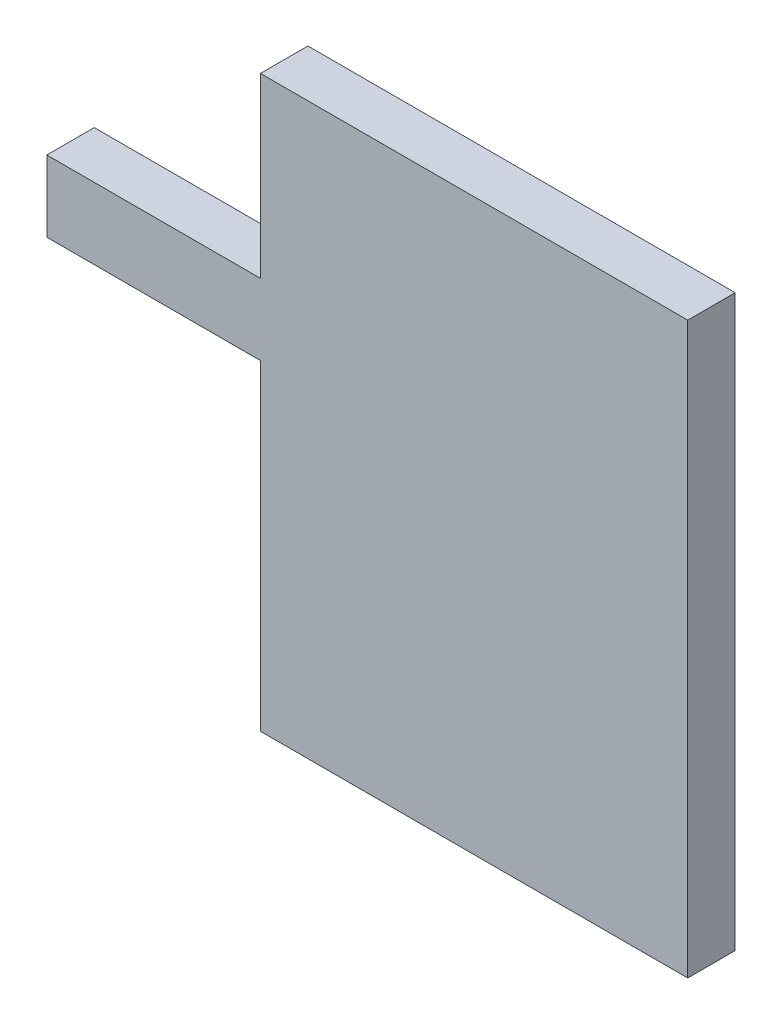
ISO-10303-21;
HEADER;
FILE_DESCRIPTION(('STEP AP214'),'2;1');
FILE_NAME('part.step','',(''),(''),'','','');
FILE_SCHEMA(('AUTOMOTIVE_DESIGN { 1 0 10303 214 1 1 1 1 }'));
ENDSEC;
DATA;
#1=APPLICATION_CONTEXT('core data for automotive mechanical design processes');
#2=APPLICATION_PROTOCOL_DEFINITION('international standard','automotive_design',2000,#1);
#3=PRODUCT_CONTEXT('',#1,'mechanical');
#4=PRODUCT('Part','Part','',(#3));
#5=PRODUCT_RELATED_PRODUCT_CATEGORY('part','',(#4));
#6=PRODUCT_DEFINITION_FORMATION('','',#4);
#7=PRODUCT_DEFINITION_CONTEXT('part definition',#1,'design');
#8=PRODUCT_DEFINITION('design','',#6,#7);
#9=PRODUCT_DEFINITION_SHAPE('','',#8);
#10=(LENGTH_UNIT() NAMED_UNIT(*) SI_UNIT(.MILLI.,.METRE.));
#11=(NAMED_UNIT(*) PLANE_ANGLE_UNIT() SI_UNIT($,.RADIAN.));
#12=(NAMED_UNIT(*) SI_UNIT($,.STERADIAN.) SOLID_ANGLE_UNIT());
#13=UNCERTAINTY_MEASURE_WITH_UNIT(LENGTH_MEASURE(1.E-05),#10,'distance_accuracy_value','');
#14=(GEOMETRIC_REPRESENTATION_CONTEXT(3) GLOBAL_UNCERTAINTY_ASSIGNED_CONTEXT((#13)) GLOBAL_UNIT_ASSIGNED_CONTEXT((#10,
#11,#12)) REPRESENTATION_CONTEXT('',''));
#15=CARTESIAN_POINT('',(0.,0.,0.));
#16=DIRECTION('',(0.,0.,1.));
#17=DIRECTION('',(1.,0.,0.));
#18=AXIS2_PLACEMENT_3D('',#15,#16,#17);
#19=CARTESIAN_POINT('',(-57.346581187662,74.8407030218855,10.));
#20=DIRECTION('',(1.,0.,0.));
#21=DIRECTION('',(0.,0.,-1.));
#22=AXIS2_PLACEMENT_3D('',#19,#20,#21);
#23=PLANE('',#22);
#24=DIRECTION('',(0.,-1.,0.));
#25=VECTOR('',#24,1.);
#26=CARTESIAN_POINT('',(-57.346581187662,74.8407030218855,0.));
#27=LINE('',#26,#25);
#28=CARTESIAN_POINT('',(-57.346581187662,74.8407030218855,0.));
#29=VERTEX_POINT('',#28);
#30=CARTESIAN_POINT('',(-57.346581187662,37.4607030218855,0.));
#31=VERTEX_POINT('',#30);
#32=EDGE_CURVE('E129',#29,#31,#27,.T.);
#33=ORIENTED_EDGE('',*,*,#32,.T.);
#34=DIRECTION('',(0.,0.,-1.));
#35=VECTOR('',#34,1.);
#36=CARTESIAN_POINT('',(-57.346581187662,37.4607030218855,10.));
#37=LINE('',#36,#35);
#38=CARTESIAN_POINT('',(-57.346581187662,37.4607030218855,10.));
#39=VERTEX_POINT('',#38);
#40=EDGE_CURVE('E11',#39,#31,#37,.T.);
#41=ORIENTED_EDGE('',*,*,#40,.F.);
#42=DIRECTION('',(0.,-1.,0.));
#43=VECTOR('',#42,1.);
#44=CARTESIAN_POINT('',(-57.346581187662,74.8407030218855,10.));
#45=LINE('',#44,#43);
#46=CARTESIAN_POINT('',(-57.346581187662,74.8407030218855,10.));
#47=VERTEX_POINT('',#46);
#48=EDGE_CURVE('E143',#47,#39,#45,.T.);
#49=ORIENTED_EDGE('',*,*,#48,.F.);
#50=DIRECTION('',(0.,0.,-1.));
#51=VECTOR('',#50,1.);
#52=CARTESIAN_POINT('',(-57.346581187662,74.8407030218855,10.));
#53=LINE('',#52,#51);
#54=EDGE_CURVE('E125',#47,#29,#53,.T.);
#55=ORIENTED_EDGE('',*,*,#54,.T.);
#56=EDGE_LOOP('',(#33,#41,#49,#55));
#57=FACE_BOUND('',#56,.T.);
#58=ADVANCED_FACE('F33',(#57),#23,.F.);
#59=CARTESIAN_POINT('',(-102.346581187662,37.4607030218855,10.));
#60=DIRECTION('',(0.,-1.,0.));
#61=DIRECTION('',(0.,0.,-1.));
#62=AXIS2_PLACEMENT_3D('',#59,#60,#61);
#63=PLANE('',#62);
#64=DIRECTION('',(-1.,0.,0.));
#65=VECTOR('',#64,1.);
#66=CARTESIAN_POINT('',(-102.346581187662,37.4607030218855,0.));
#67=LINE('',#66,#65);
#68=CARTESIAN_POINT('',(-102.346581187662,37.4607030218855,0.));
#69=VERTEX_POINT('',#68);
#70=EDGE_CURVE('E132',#31,#69,#67,.T.);
#71=ORIENTED_EDGE('',*,*,#70,.T.);
#72=DIRECTION('',(0.,0.,-1.));
#73=VECTOR('',#72,1.);
#74=CARTESIAN_POINT('',(-102.346581187662,37.4607030218855,10.));
#75=LINE('',#74,#73);
#76=CARTESIAN_POINT('',(-102.346581187662,37.4607030218855,10.));
#77=VERTEX_POINT('',#76);
#78=EDGE_CURVE('E41',#77,#69,#75,.T.);
#79=ORIENTED_EDGE('',*,*,#78,.F.);
#80=DIRECTION('',(-1.,0.,0.));
#81=VECTOR('',#80,1.);
#82=CARTESIAN_POINT('',(-102.346581187662,37.4607030218855,10.));
#83=LINE('',#82,#81);
#84=EDGE_CURVE('E92',#39,#77,#83,.T.);
#85=ORIENTED_EDGE('',*,*,#84,.F.);
#86=ORIENTED_EDGE('',*,*,#40,.T.);
#87=EDGE_LOOP('',(#71,#79,#85,#86));
#88=FACE_BOUND('',#87,.T.);
#89=ADVANCED_FACE('F178',(#88),#63,.F.);
#90=CARTESIAN_POINT('',(-102.346581187662,37.4607030218855,10.));
#91=DIRECTION('',(1.,0.,0.));
#92=DIRECTION('',(0.,0.,-1.));
#93=AXIS2_PLACEMENT_3D('',#90,#91,#92);
#94=PLANE('',#93);
#95=DIRECTION('',(0.,-1.,0.));
#96=VECTOR('',#95,1.);
#97=CARTESIAN_POINT('',(-102.346581187662,37.4607030218855,0.));
#98=LINE('',#97,#96);
#99=CARTESIAN_POINT('',(-102.346581187662,22.4607030218855,0.));
#100=VERTEX_POINT('',#99);
#101=EDGE_CURVE('E134',#69,#100,#98,.T.);
#102=ORIENTED_EDGE('',*,*,#101,.T.);
#103=DIRECTION('',(0.,0.,-1.));
#104=VECTOR('',#103,1.);
#105=CARTESIAN_POINT('',(-102.346581187662,22.4607030218855,10.));
#106=LINE('',#105,#104);
#107=CARTESIAN_POINT('',(-102.346581187662,22.4607030218855,10.));
#108=VERTEX_POINT('',#107);
#109=EDGE_CURVE('E150',#108,#100,#106,.T.);
#110=ORIENTED_EDGE('',*,*,#109,.F.);
#111=DIRECTION('',(0.,-1.,0.));
#112=VECTOR('',#111,1.);
#113=CARTESIAN_POINT('',(-102.346581187662,37.4607030218855,10.));
#114=LINE('',#113,#112);
#115=EDGE_CURVE('E158',#77,#108,#114,.T.);
#116=ORIENTED_EDGE('',*,*,#115,.F.);
#117=ORIENTED_EDGE('',*,*,#78,.T.);
#118=EDGE_LOOP('',(#102,#110,#116,#117));
#119=FACE_BOUND('',#118,.T.);
#120=ADVANCED_FACE('F156',(#119),#94,.F.);
#121=CARTESIAN_POINT('',(-102.346581187662,22.4607030218855,10.));
#122=DIRECTION('',(0.,1.,0.));
#123=DIRECTION('',(0.,0.,1.));
#124=AXIS2_PLACEMENT_3D('',#121,#122,#123);
#125=PLANE('',#124);
#126=DIRECTION('',(1.,0.,0.));
#127=VECTOR('',#126,1.);
#128=CARTESIAN_POINT('',(-102.346581187662,22.4607030218855,0.));
#129=LINE('',#128,#127);
#130=CARTESIAN_POINT('',(-57.346581187662,22.4607030218855,0.));
#131=VERTEX_POINT('',#130);
#132=EDGE_CURVE('E136',#100,#131,#129,.T.);
#133=ORIENTED_EDGE('',*,*,#132,.T.);
#134=DIRECTION('',(0.,0.,-1.));
#135=VECTOR('',#134,1.);
#136=CARTESIAN_POINT('',(-57.346581187662,22.4607030218855,10.));
#137=LINE('',#136,#135);
#138=CARTESIAN_POINT('',(-57.346581187662,22.4607030218855,10.));
#139=VERTEX_POINT('',#138);
#140=EDGE_CURVE('E147',#139,#131,#137,.T.);
#141=ORIENTED_EDGE('',*,*,#140,.F.);
#142=DIRECTION('',(1.,0.,0.));
#143=VECTOR('',#142,1.);
#144=CARTESIAN_POINT('',(-102.346581187662,22.4607030218855,10.));
#145=LINE('',#144,#143);
#146=EDGE_CURVE('E170',#108,#139,#145,.T.);
#147=ORIENTED_EDGE('',*,*,#146,.F.);
#148=ORIENTED_EDGE('',*,*,#109,.T.);
#149=EDGE_LOOP('',(#133,#141,#147,#148));
#150=FACE_BOUND('',#149,.T.);
#151=ADVANCED_FACE('F166',(#150),#125,.F.);
#152=CARTESIAN_POINT('',(-57.346581187662,22.4607030218855,10.));
#153=DIRECTION('',(1.,0.,0.));
#154=DIRECTION('',(0.,1.,0.));
#155=AXIS2_PLACEMENT_3D('',#152,#153,#154);
#156=PLANE('',#155);
#157=DIRECTION('',(0.,-1.,0.));
#158=VECTOR('',#157,1.);
#159=CARTESIAN_POINT('',(-57.346581187662,22.4607030218855,0.));
#160=LINE('',#159,#158);
#161=CARTESIAN_POINT('',(-57.346581187662,-45.1592969781145,0.));
#162=VERTEX_POINT('',#161);
#163=EDGE_CURVE('E138',#131,#162,#160,.T.);
#164=ORIENTED_EDGE('',*,*,#163,.T.);
#165=DIRECTION('',(0.,0.,-1.));
#166=VECTOR('',#165,1.);
#167=CARTESIAN_POINT('',(-57.346581187662,-45.1592969781145,10.));
#168=LINE('',#167,#166);
#169=CARTESIAN_POINT('',(-57.346581187662,-45.1592969781145,10.));
#170=VERTEX_POINT('',#169);
#171=EDGE_CURVE('E120',#170,#162,#168,.T.);
#172=ORIENTED_EDGE('',*,*,#171,.F.);
#173=DIRECTION('',(0.,-1.,0.));
#174=VECTOR('',#173,1.);
#175=CARTESIAN_POINT('',(-57.346581187662,22.4607030218855,10.));
#176=LINE('',#175,#174);
#177=EDGE_CURVE('E111',#139,#170,#176,.T.);
#178=ORIENTED_EDGE('',*,*,#177,.F.);
#179=ORIENTED_EDGE('',*,*,#140,.T.);
#180=EDGE_LOOP('',(#164,#172,#178,#179));
#181=FACE_BOUND('',#180,.T.);
#182=ADVANCED_FACE('F169',(#181),#156,.F.);
#183=CARTESIAN_POINT('',(-57.346581187662,-45.1592969781145,10.));
#184=DIRECTION('',(0.,1.,0.));
#185=DIRECTION('',(-1.,0.,0.));
#186=AXIS2_PLACEMENT_3D('',#183,#184,#185);
#187=PLANE('',#186);
#188=DIRECTION('',(1.,0.,0.));
#189=VECTOR('',#188,1.);
#190=CARTESIAN_POINT('',(-57.346581187662,-45.1592969781145,0.));
#191=LINE('',#190,#189);
#192=CARTESIAN_POINT('',(32.653418812338,-45.1592969781145,0.));
#193=VERTEX_POINT('',#192);
#194=EDGE_CURVE('E119',#162,#193,#191,.T.);
#195=ORIENTED_EDGE('',*,*,#194,.T.);
#196=DIRECTION('',(0.,0.,-1.));
#197=VECTOR('',#196,1.);
#198=CARTESIAN_POINT('',(32.653418812338,-45.1592969781145,10.));
#199=LINE('',#198,#197);
#200=CARTESIAN_POINT('',(32.653418812338,-45.1592969781145,10.));
#201=VERTEX_POINT('',#200);
#202=EDGE_CURVE('E116',#201,#193,#199,.T.);
#203=ORIENTED_EDGE('',*,*,#202,.F.);
#204=DIRECTION('',(1.,0.,0.));
#205=VECTOR('',#204,1.);
#206=CARTESIAN_POINT('',(-57.346581187662,-45.1592969781145,10.));
#207=LINE('',#206,#205);
#208=EDGE_CURVE('E105',#170,#201,#207,.T.);
#209=ORIENTED_EDGE('',*,*,#208,.F.);
#210=ORIENTED_EDGE('',*,*,#171,.T.);
#211=EDGE_LOOP('',(#195,#203,#209,#210));
#212=FACE_BOUND('',#211,.T.);
#213=ADVANCED_FACE('F117',(#212),#187,.F.);
#214=CARTESIAN_POINT('',(32.653418812338,74.8407030218855,10.));
#215=DIRECTION('',(-1.,0.,0.));
#216=DIRECTION('',(0.,-1.,0.));
#217=AXIS2_PLACEMENT_3D('',#214,#215,#216);
#218=PLANE('',#217);
#219=DIRECTION('',(0.,1.,0.));
#220=VECTOR('',#219,1.);
#221=CARTESIAN_POINT('',(32.653418812338,74.8407030218855,0.));
#222=LINE('',#221,#220);
#223=CARTESIAN_POINT('',(32.653418812338,74.8407030218855,0.));
#224=VERTEX_POINT('',#223);
#225=EDGE_CURVE('E78',#193,#224,#222,.T.);
#226=ORIENTED_EDGE('',*,*,#225,.T.);
#227=DIRECTION('',(0.,0.,-1.));
#228=VECTOR('',#227,1.);
#229=CARTESIAN_POINT('',(32.653418812338,74.8407030218855,10.));
#230=LINE('',#229,#228);
#231=CARTESIAN_POINT('',(32.653418812338,74.8407030218855,10.));
#232=VERTEX_POINT('',#231);
#233=EDGE_CURVE('E121',#232,#224,#230,.T.);
#234=ORIENTED_EDGE('',*,*,#233,.F.);
#235=DIRECTION('',(0.,1.,0.));
#236=VECTOR('',#235,1.);
#237=CARTESIAN_POINT('',(32.653418812338,74.8407030218855,10.));
#238=LINE('',#237,#236);
#239=EDGE_CURVE('E109',#201,#232,#238,.T.);
#240=ORIENTED_EDGE('',*,*,#239,.F.);
#241=ORIENTED_EDGE('',*,*,#202,.T.);
#242=EDGE_LOOP('',(#226,#234,#240,#241));
#243=FACE_BOUND('',#242,.T.);
#244=ADVANCED_FACE('F123',(#243),#218,.F.);
#245=CARTESIAN_POINT('',(-57.346581187662,74.8407030218855,10.));
#246=DIRECTION('',(0.,-1.,0.));
#247=DIRECTION('',(1.,0.,0.));
#248=AXIS2_PLACEMENT_3D('',#245,#246,#247);
#249=PLANE('',#248);
#250=DIRECTION('',(-1.,0.,0.));
#251=VECTOR('',#250,1.);
#252=CARTESIAN_POINT('',(-57.346581187662,74.8407030218855,0.));
#253=LINE('',#252,#251);
#254=EDGE_CURVE('E84',#224,#29,#253,.T.);
#255=ORIENTED_EDGE('',*,*,#254,.T.);
#256=ORIENTED_EDGE('',*,*,#54,.F.);
#257=DIRECTION('',(-1.,0.,0.));
#258=VECTOR('',#257,1.);
#259=CARTESIAN_POINT('',(-57.346581187662,74.8407030218855,10.));
#260=LINE('',#259,#258);
#261=EDGE_CURVE('E49',#232,#47,#260,.T.);
#262=ORIENTED_EDGE('',*,*,#261,.F.);
#263=ORIENTED_EDGE('',*,*,#233,.T.);
#264=EDGE_LOOP('',(#255,#256,#262,#263));
#265=FACE_BOUND('',#264,.T.);
#266=ADVANCED_FACE('F194',(#265),#249,.F.);
#267=CARTESIAN_POINT('',(0.,0.,10.));
#268=DIRECTION('',(0.,0.,1.));
#269=DIRECTION('',(1.,0.,0.));
#270=AXIS2_PLACEMENT_3D('',#267,#268,#269);
#271=PLANE('',#270);
#272=ORIENTED_EDGE('',*,*,#48,.T.);
#273=ORIENTED_EDGE('',*,*,#84,.T.);
#274=ORIENTED_EDGE('',*,*,#115,.T.);
#275=ORIENTED_EDGE('',*,*,#146,.T.);
#276=ORIENTED_EDGE('',*,*,#177,.T.);
#277=ORIENTED_EDGE('',*,*,#208,.T.);
#278=ORIENTED_EDGE('',*,*,#239,.T.);
#279=ORIENTED_EDGE('',*,*,#261,.T.);
#280=EDGE_LOOP('',(#272,#273,#274,#275,#276,#277,#278,#279));
#281=FACE_BOUND('',#280,.T.);
#282=ADVANCED_FACE('F107',(#281),#271,.T.);
#283=CARTESIAN_POINT('',(0.,0.,0.));
#284=DIRECTION('',(0.,0.,1.));
#285=DIRECTION('',(1.,0.,0.));
#286=AXIS2_PLACEMENT_3D('',#283,#284,#285);
#287=PLANE('',#286);
#288=ORIENTED_EDGE('',*,*,#32,.F.);
#289=ORIENTED_EDGE('',*,*,#254,.F.);
#290=ORIENTED_EDGE('',*,*,#225,.F.);
#291=ORIENTED_EDGE('',*,*,#194,.F.);
#292=ORIENTED_EDGE('',*,*,#163,.F.);
#293=ORIENTED_EDGE('',*,*,#132,.F.);
#294=ORIENTED_EDGE('',*,*,#101,.F.);
#295=ORIENTED_EDGE('',*,*,#70,.F.);
#296=EDGE_LOOP('',(#288,#289,#290,#291,#292,#293,#294,#295));
#297=FACE_BOUND('',#296,.T.);
#298=ADVANCED_FACE('F162',(#297),#287,.F.);
#299=CLOSED_SHELL('',(#58,#89,#120,#151,#182,#213,#244,#266,#282,#298));
#300=MANIFOLD_SOLID_BREP('B2',#299);
#301=ADVANCED_BREP_SHAPE_REPRESENTATION('',(#18,#300),#14);
#302=SHAPE_DEFINITION_REPRESENTATION(#9,#301);
ENDSEC;
END-ISO-10303-21;
